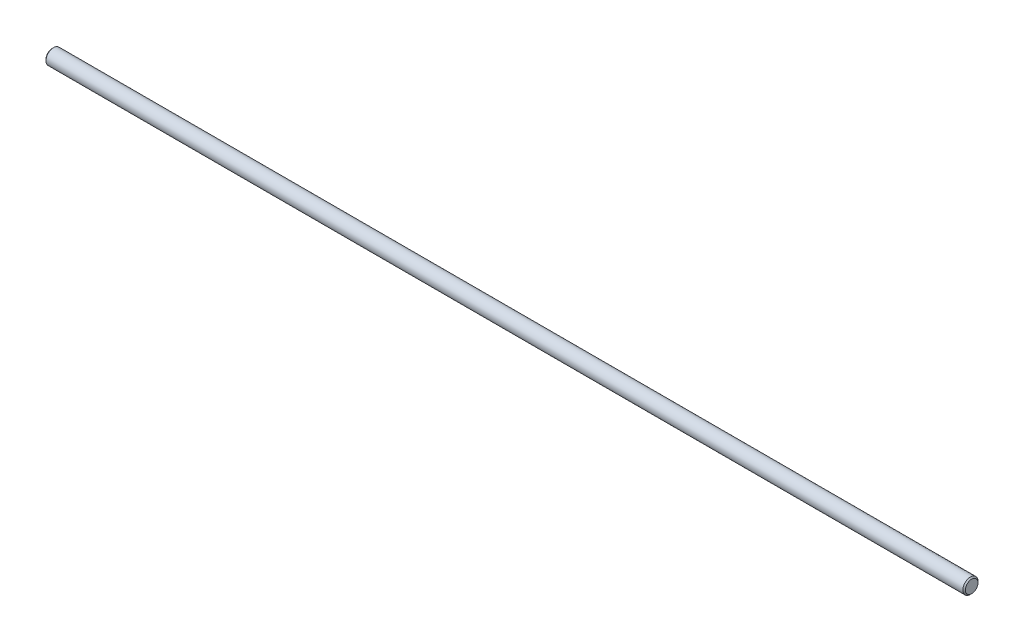
ISO-10303-21;
HEADER;
FILE_DESCRIPTION(('STEP AP214'),'2;1');
FILE_NAME('part.step','',(''),(''),'','','');
FILE_SCHEMA(('AUTOMOTIVE_DESIGN { 1 0 10303 214 1 1 1 1 }'));
ENDSEC;
DATA;
#1=APPLICATION_CONTEXT('core data for automotive mechanical design processes');
#2=APPLICATION_PROTOCOL_DEFINITION('international standard','automotive_design',2000,#1);
#3=PRODUCT_CONTEXT('',#1,'mechanical');
#4=PRODUCT('Part','Part','',(#3));
#5=PRODUCT_RELATED_PRODUCT_CATEGORY('part','',(#4));
#6=PRODUCT_DEFINITION_FORMATION('','',#4);
#7=PRODUCT_DEFINITION_CONTEXT('part definition',#1,'design');
#8=PRODUCT_DEFINITION('design','',#6,#7);
#9=PRODUCT_DEFINITION_SHAPE('','',#8);
#10=(LENGTH_UNIT() NAMED_UNIT(*) SI_UNIT(.MILLI.,.METRE.));
#11=(NAMED_UNIT(*) PLANE_ANGLE_UNIT() SI_UNIT($,.RADIAN.));
#12=(NAMED_UNIT(*) SI_UNIT($,.STERADIAN.) SOLID_ANGLE_UNIT());
#13=UNCERTAINTY_MEASURE_WITH_UNIT(LENGTH_MEASURE(1.E-05),#10,'distance_accuracy_value','');
#14=(GEOMETRIC_REPRESENTATION_CONTEXT(3) GLOBAL_UNCERTAINTY_ASSIGNED_CONTEXT((#13)) GLOBAL_UNIT_ASSIGNED_CONTEXT((#10,
#11,#12)) REPRESENTATION_CONTEXT('',''));
#15=CARTESIAN_POINT('',(0.,0.,0.));
#16=DIRECTION('',(0.,0.,1.));
#17=DIRECTION('',(1.,0.,0.));
#18=AXIS2_PLACEMENT_3D('',#15,#16,#17);
#19=CARTESIAN_POINT('',(-364.,2.52000000000061,47.3999999999998));
#20=DIRECTION('',(1.,0.,0.));
#21=DIRECTION('',(0.,0.,-1.));
#22=AXIS2_PLACEMENT_3D('',#19,#20,#21);
#23=CYLINDRICAL_SURFACE('',#22,3.);
#24=CARTESIAN_POINT('',(-363.5,2.52000000000061,47.3999999999998));
#25=DIRECTION('',(1.,0.,0.));
#26=DIRECTION('',(0.,0.,-1.));
#27=AXIS2_PLACEMENT_3D('',#24,#25,#26);
#28=CIRCLE('',#27,3.);
#29=CARTESIAN_POINT('',(-363.5,2.52000000000061,44.3999999999998));
#30=VERTEX_POINT('',#29);
#31=EDGE_CURVE('E49',#30,#30,#28,.T.);
#32=ORIENTED_EDGE('',*,*,#31,.T.);
#33=EDGE_LOOP('',(#32));
#34=FACE_BOUND('',#33,.T.);
#35=CARTESIAN_POINT('',(-0.5,2.52000000000061,47.3999999999998));
#36=DIRECTION('',(1.,0.,0.));
#37=DIRECTION('',(0.,0.,-1.));
#38=AXIS2_PLACEMENT_3D('',#35,#36,#37);
#39=CIRCLE('',#38,3.);
#40=CARTESIAN_POINT('',(-0.5,2.52000000000061,44.3999999999998));
#41=VERTEX_POINT('',#40);
#42=EDGE_CURVE('E53',#41,#41,#39,.F.);
#43=ORIENTED_EDGE('',*,*,#42,.T.);
#44=EDGE_LOOP('',(#43));
#45=FACE_BOUND('',#44,.T.);
#46=ADVANCED_FACE('F37',(#34,#45),#23,.T.);
#47=CARTESIAN_POINT('',(-364.,2.52000000000061,47.3999999999998));
#48=DIRECTION('',(1.,0.,0.));
#49=DIRECTION('',(0.,0.,-1.));
#50=AXIS2_PLACEMENT_3D('',#47,#48,#49);
#51=PLANE('',#50);
#52=CARTESIAN_POINT('',(-364.,2.52000000000061,47.3999999999998));
#53=DIRECTION('',(1.,0.,0.));
#54=DIRECTION('',(0.,0.,-1.));
#55=AXIS2_PLACEMENT_3D('',#52,#53,#54);
#56=CIRCLE('',#55,2.49999999999995);
#57=CARTESIAN_POINT('',(-364.,2.52000000000061,44.8999999999999));
#58=VERTEX_POINT('',#57);
#59=EDGE_CURVE('E45',#58,#58,#56,.F.);
#60=ORIENTED_EDGE('',*,*,#59,.T.);
#61=EDGE_LOOP('',(#60));
#62=FACE_BOUND('',#61,.T.);
#63=ADVANCED_FACE('F69',(#62),#51,.F.);
#64=CARTESIAN_POINT('',(0.,2.52000000000061,47.3999999999998));
#65=DIRECTION('',(1.,0.,0.));
#66=DIRECTION('',(0.,0.,-1.));
#67=AXIS2_PLACEMENT_3D('',#64,#65,#66);
#68=PLANE('',#67);
#69=CARTESIAN_POINT('',(0.,2.52000000000061,47.3999999999998));
#70=DIRECTION('',(1.,0.,0.));
#71=DIRECTION('',(0.,0.,-1.));
#72=AXIS2_PLACEMENT_3D('',#69,#70,#71);
#73=CIRCLE('',#72,2.5);
#74=CARTESIAN_POINT('',(0.,2.52000000000061,44.8999999999998));
#75=VERTEX_POINT('',#74);
#76=EDGE_CURVE('E10',#75,#75,#73,.T.);
#77=ORIENTED_EDGE('',*,*,#76,.T.);
#78=EDGE_LOOP('',(#77));
#79=FACE_BOUND('',#78,.T.);
#80=ADVANCED_FACE('F66',(#79),#68,.T.);
#81=CARTESIAN_POINT('',(-363.5,2.52000000000061,47.3999999999998));
#82=DIRECTION('',(1.,0.,0.));
#83=DIRECTION('',(0.,0.,-1.));
#84=AXIS2_PLACEMENT_3D('',#81,#82,#83);
#85=CONICAL_SURFACE('',#84,3.,0.785398163397447);
#86=ORIENTED_EDGE('',*,*,#59,.F.);
#87=EDGE_LOOP('',(#86));
#88=FACE_BOUND('',#87,.T.);
#89=ORIENTED_EDGE('',*,*,#31,.F.);
#90=EDGE_LOOP('',(#89));
#91=FACE_BOUND('',#90,.T.);
#92=ADVANCED_FACE('F62',(#88,#91),#85,.T.);
#93=CARTESIAN_POINT('',(0.,2.52000000000061,47.3999999999998));
#94=DIRECTION('',(-1.,0.,0.));
#95=DIRECTION('',(0.,0.,1.));
#96=AXIS2_PLACEMENT_3D('',#93,#94,#95);
#97=CONICAL_SURFACE('',#96,2.5,0.785398163397447);
#98=ORIENTED_EDGE('',*,*,#42,.F.);
#99=EDGE_LOOP('',(#98));
#100=FACE_BOUND('',#99,.T.);
#101=ORIENTED_EDGE('',*,*,#76,.F.);
#102=EDGE_LOOP('',(#101));
#103=FACE_BOUND('',#102,.T.);
#104=ADVANCED_FACE('F40',(#100,#103),#97,.T.);
#105=CLOSED_SHELL('',(#46,#63,#80,#92,#104));
#106=MANIFOLD_SOLID_BREP('B2',#105);
#107=ADVANCED_BREP_SHAPE_REPRESENTATION('',(#18,#106),#14);
#108=SHAPE_DEFINITION_REPRESENTATION(#9,#107);
ENDSEC;
END-ISO-10303-21;
